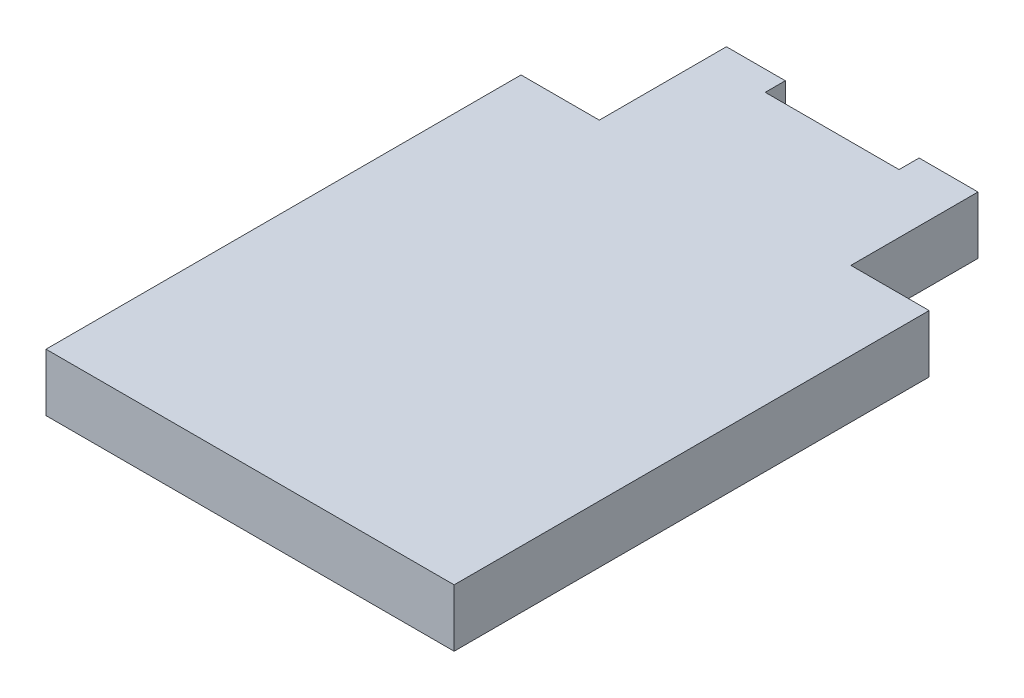
ISO-10303-21;
HEADER;
FILE_DESCRIPTION(('STEP AP214'),'2;1');
FILE_NAME('part.step','',(''),(''),'','','');
FILE_SCHEMA(('AUTOMOTIVE_DESIGN { 1 0 10303 214 1 1 1 1 }'));
ENDSEC;
DATA;
#1=APPLICATION_CONTEXT('core data for automotive mechanical design processes');
#2=APPLICATION_PROTOCOL_DEFINITION('international standard','automotive_design',2000,#1);
#3=PRODUCT_CONTEXT('',#1,'mechanical');
#4=PRODUCT('Part','Part','',(#3));
#5=PRODUCT_RELATED_PRODUCT_CATEGORY('part','',(#4));
#6=PRODUCT_DEFINITION_FORMATION('','',#4);
#7=PRODUCT_DEFINITION_CONTEXT('part definition',#1,'design');
#8=PRODUCT_DEFINITION('design','',#6,#7);
#9=PRODUCT_DEFINITION_SHAPE('','',#8);
#10=(LENGTH_UNIT() NAMED_UNIT(*) SI_UNIT(.MILLI.,.METRE.));
#11=(NAMED_UNIT(*) PLANE_ANGLE_UNIT() SI_UNIT($,.RADIAN.));
#12=(NAMED_UNIT(*) SI_UNIT($,.STERADIAN.) SOLID_ANGLE_UNIT());
#13=UNCERTAINTY_MEASURE_WITH_UNIT(LENGTH_MEASURE(1.E-05),#10,'distance_accuracy_value','');
#14=(GEOMETRIC_REPRESENTATION_CONTEXT(3) GLOBAL_UNCERTAINTY_ASSIGNED_CONTEXT((#13)) GLOBAL_UNIT_ASSIGNED_CONTEXT((#10,
#11,#12)) REPRESENTATION_CONTEXT('',''));
#15=CARTESIAN_POINT('',(0.,0.,0.));
#16=DIRECTION('',(0.,0.,1.));
#17=DIRECTION('',(1.,0.,0.));
#18=AXIS2_PLACEMENT_3D('',#15,#16,#17);
#19=CARTESIAN_POINT('',(-10.0680991990088,-7.54642357765199,-3.3));
#20=DIRECTION('',(0.,1.,0.));
#21=DIRECTION('',(0.,0.,1.));
#22=AXIS2_PLACEMENT_3D('',#19,#20,#21);
#23=PLANE('',#22);
#24=DIRECTION('',(-1.,0.,0.));
#25=VECTOR('',#24,1.);
#26=CARTESIAN_POINT('',(-10.0680991990088,-7.54642357765199,-3.3));
#27=LINE('',#26,#25);
#28=CARTESIAN_POINT('',(-8.62809919900875,-7.54642357765199,-3.3));
#29=VERTEX_POINT('',#28);
#30=CARTESIAN_POINT('',(-9.06809919900875,-7.54642357765199,-3.3));
#31=VERTEX_POINT('',#30);
#32=EDGE_CURVE('E11',#29,#31,#27,.T.);
#33=ORIENTED_EDGE('',*,*,#32,.T.);
#34=DIRECTION('',(0.,0.,1.));
#35=VECTOR('',#34,1.);
#36=CARTESIAN_POINT('',(-9.06809919900875,-7.54642357765199,-3.3));
#37=LINE('',#36,#35);
#38=CARTESIAN_POINT('',(-9.06809919900875,-7.54642357765199,-3.15));
#39=VERTEX_POINT('',#38);
#40=EDGE_CURVE('E24',#31,#39,#37,.T.);
#41=ORIENTED_EDGE('',*,*,#40,.T.);
#42=DIRECTION('',(-1.,0.,0.));
#43=VECTOR('',#42,1.);
#44=CARTESIAN_POINT('',(-10.0680991990088,-7.54642357765199,-3.15));
#45=LINE('',#44,#43);
#46=CARTESIAN_POINT('',(-10.0680991990088,-7.54642357765199,-3.15));
#47=VERTEX_POINT('',#46);
#48=EDGE_CURVE('E200',#39,#47,#45,.T.);
#49=ORIENTED_EDGE('',*,*,#48,.T.);
#50=DIRECTION('',(0.,0.,-1.));
#51=VECTOR('',#50,1.);
#52=CARTESIAN_POINT('',(-10.0680991990088,-7.54642357765199,-3.3));
#53=LINE('',#52,#51);
#54=CARTESIAN_POINT('',(-10.0680991990088,-7.54642357765199,-3.3));
#55=VERTEX_POINT('',#54);
#56=EDGE_CURVE('E118',#47,#55,#53,.T.);
#57=ORIENTED_EDGE('',*,*,#56,.T.);
#58=DIRECTION('',(-1.,0.,0.));
#59=VECTOR('',#58,1.);
#60=CARTESIAN_POINT('',(-10.0680991990088,-7.54642357765199,-3.3));
#61=LINE('',#60,#59);
#62=CARTESIAN_POINT('',(-10.5080991990088,-7.54642357765199,-3.3));
#63=VERTEX_POINT('',#62);
#64=EDGE_CURVE('E197',#55,#63,#61,.T.);
#65=ORIENTED_EDGE('',*,*,#64,.T.);
#66=DIRECTION('',(0.,0.,1.));
#67=VECTOR('',#66,1.);
#68=CARTESIAN_POINT('',(-10.5080991990088,-7.54642357765199,-3.3));
#69=LINE('',#68,#67);
#70=CARTESIAN_POINT('',(-10.5080991990088,-7.54642357765199,-2.35));
#71=VERTEX_POINT('',#70);
#72=EDGE_CURVE('E195',#63,#71,#69,.T.);
#73=ORIENTED_EDGE('',*,*,#72,.T.);
#74=DIRECTION('',(-1.,0.,0.));
#75=VECTOR('',#74,1.);
#76=CARTESIAN_POINT('',(-10.0680991990088,-7.54642357765199,-2.35));
#77=LINE('',#76,#75);
#78=CARTESIAN_POINT('',(-11.0930991990088,-7.54642357765199,-2.35));
#79=VERTEX_POINT('',#78);
#80=EDGE_CURVE('E193',#71,#79,#77,.T.);
#81=ORIENTED_EDGE('',*,*,#80,.T.);
#82=DIRECTION('',(0.,0.,1.));
#83=VECTOR('',#82,1.);
#84=CARTESIAN_POINT('',(-11.0930991990088,-7.54642357765199,-3.3));
#85=LINE('',#84,#83);
#86=CARTESIAN_POINT('',(-11.0930991990088,-7.54642357765198,1.2));
#87=VERTEX_POINT('',#86);
#88=EDGE_CURVE('E191',#79,#87,#85,.T.);
#89=ORIENTED_EDGE('',*,*,#88,.T.);
#90=DIRECTION('',(1.,0.,0.));
#91=VECTOR('',#90,1.);
#92=CARTESIAN_POINT('',(-10.0680991990088,-7.54642357765199,1.2));
#93=LINE('',#92,#91);
#94=CARTESIAN_POINT('',(-8.04309919900875,-7.54642357765199,1.2));
#95=VERTEX_POINT('',#94);
#96=EDGE_CURVE('E189',#87,#95,#93,.T.);
#97=ORIENTED_EDGE('',*,*,#96,.T.);
#98=DIRECTION('',(0.,0.,-1.));
#99=VECTOR('',#98,1.);
#100=CARTESIAN_POINT('',(-8.04309919900875,-7.54642357765199,-3.3));
#101=LINE('',#100,#99);
#102=CARTESIAN_POINT('',(-8.04309919900875,-7.54642357765199,-2.35));
#103=VERTEX_POINT('',#102);
#104=EDGE_CURVE('E187',#95,#103,#101,.T.);
#105=ORIENTED_EDGE('',*,*,#104,.T.);
#106=DIRECTION('',(-1.,0.,0.));
#107=VECTOR('',#106,1.);
#108=CARTESIAN_POINT('',(-10.0680991990088,-7.54642357765199,-2.35));
#109=LINE('',#108,#107);
#110=CARTESIAN_POINT('',(-8.62809919900875,-7.54642357765199,-2.35));
#111=VERTEX_POINT('',#110);
#112=EDGE_CURVE('E185',#103,#111,#109,.T.);
#113=ORIENTED_EDGE('',*,*,#112,.T.);
#114=DIRECTION('',(0.,0.,-1.));
#115=VECTOR('',#114,1.);
#116=CARTESIAN_POINT('',(-8.62809919900875,-7.54642357765199,-3.3));
#117=LINE('',#116,#115);
#118=EDGE_CURVE('E183',#111,#29,#117,.T.);
#119=ORIENTED_EDGE('',*,*,#118,.T.);
#120=EDGE_LOOP('',(#33,#41,#49,#57,#65,#73,#81,#89,#97,#105,#113,#119));
#121=FACE_BOUND('',#120,.T.);
#122=ADVANCED_FACE('F17',(#121),#23,.T.);
#123=CARTESIAN_POINT('',(-9.06809919900875,-7.97642357765199,-3.225));
#124=DIRECTION('',(-1.,0.,0.));
#125=DIRECTION('',(0.,0.,1.));
#126=AXIS2_PLACEMENT_3D('',#123,#124,#125);
#127=PLANE('',#126);
#128=DIRECTION('',(0.,0.,1.));
#129=VECTOR('',#128,1.);
#130=CARTESIAN_POINT('',(-9.06809919900875,-7.97642357765199,-2.825));
#131=LINE('',#130,#129);
#132=CARTESIAN_POINT('',(-9.06809919900875,-7.97642357765199,-3.3));
#133=VERTEX_POINT('',#132);
#134=CARTESIAN_POINT('',(-9.06809919900875,-7.97642357765199,-3.15));
#135=VERTEX_POINT('',#134);
#136=EDGE_CURVE('E181',#133,#135,#131,.T.);
#137=ORIENTED_EDGE('',*,*,#136,.T.);
#138=DIRECTION('',(0.,1.,0.));
#139=VECTOR('',#138,1.);
#140=CARTESIAN_POINT('',(-9.06809919900875,-7.97642357765199,-3.15));
#141=LINE('',#140,#139);
#142=EDGE_CURVE('E125',#135,#39,#141,.T.);
#143=ORIENTED_EDGE('',*,*,#142,.T.);
#144=ORIENTED_EDGE('',*,*,#40,.F.);
#145=DIRECTION('',(0.,-1.,0.));
#146=VECTOR('',#145,1.);
#147=CARTESIAN_POINT('',(-9.06809919900875,-7.97642357765199,-3.3));
#148=LINE('',#147,#146);
#149=EDGE_CURVE('E177',#31,#133,#148,.T.);
#150=ORIENTED_EDGE('',*,*,#149,.T.);
#151=EDGE_LOOP('',(#137,#143,#144,#150));
#152=FACE_BOUND('',#151,.T.);
#153=ADVANCED_FACE('F202',(#152),#127,.T.);
#154=CARTESIAN_POINT('',(-8.84809919900875,-7.97642357765199,-3.3));
#155=DIRECTION('',(0.,0.,-1.));
#156=DIRECTION('',(0.,1.,0.));
#157=AXIS2_PLACEMENT_3D('',#154,#155,#156);
#158=PLANE('',#157);
#159=DIRECTION('',(-1.,0.,0.));
#160=VECTOR('',#159,1.);
#161=CARTESIAN_POINT('',(-9.56809919900875,-7.97642357765199,-3.3));
#162=LINE('',#161,#160);
#163=CARTESIAN_POINT('',(-8.62809919900875,-7.97642357765199,-3.3));
#164=VERTEX_POINT('',#163);
#165=EDGE_CURVE('E174',#164,#133,#162,.T.);
#166=ORIENTED_EDGE('',*,*,#165,.T.);
#167=ORIENTED_EDGE('',*,*,#149,.F.);
#168=ORIENTED_EDGE('',*,*,#32,.F.);
#169=DIRECTION('',(0.,-1.,0.));
#170=VECTOR('',#169,1.);
#171=CARTESIAN_POINT('',(-8.62809919900875,-7.97642357765199,-3.3));
#172=LINE('',#171,#170);
#173=EDGE_CURVE('E172',#29,#164,#172,.T.);
#174=ORIENTED_EDGE('',*,*,#173,.T.);
#175=EDGE_LOOP('',(#166,#167,#168,#174));
#176=FACE_BOUND('',#175,.T.);
#177=ADVANCED_FACE('F204',(#176),#158,.T.);
#178=CARTESIAN_POINT('',(-8.62809919900875,-7.97642357765199,-2.825));
#179=DIRECTION('',(1.,0.,0.));
#180=DIRECTION('',(0.,0.,-1.));
#181=AXIS2_PLACEMENT_3D('',#178,#179,#180);
#182=PLANE('',#181);
#183=DIRECTION('',(0.,0.,-1.));
#184=VECTOR('',#183,1.);
#185=CARTESIAN_POINT('',(-8.62809919900875,-7.97642357765199,-2.825));
#186=LINE('',#185,#184);
#187=CARTESIAN_POINT('',(-8.62809919900875,-7.97642357765199,-2.35));
#188=VERTEX_POINT('',#187);
#189=EDGE_CURVE('E169',#188,#164,#186,.T.);
#190=ORIENTED_EDGE('',*,*,#189,.T.);
#191=ORIENTED_EDGE('',*,*,#173,.F.);
#192=ORIENTED_EDGE('',*,*,#118,.F.);
#193=DIRECTION('',(0.,-1.,0.));
#194=VECTOR('',#193,1.);
#195=CARTESIAN_POINT('',(-8.62809919900875,-7.97642357765199,-2.35));
#196=LINE('',#195,#194);
#197=EDGE_CURVE('E166',#111,#188,#196,.T.);
#198=ORIENTED_EDGE('',*,*,#197,.T.);
#199=EDGE_LOOP('',(#190,#191,#192,#198));
#200=FACE_BOUND('',#199,.T.);
#201=ADVANCED_FACE('F207',(#200),#182,.T.);
#202=CARTESIAN_POINT('',(-8.33559919900875,-7.97642357765199,-2.35));
#203=DIRECTION('',(0.,0.,-1.));
#204=DIRECTION('',(0.,1.,0.));
#205=AXIS2_PLACEMENT_3D('',#202,#203,#204);
#206=PLANE('',#205);
#207=DIRECTION('',(-1.,0.,0.));
#208=VECTOR('',#207,1.);
#209=CARTESIAN_POINT('',(-9.56809919900875,-7.97642357765199,-2.35));
#210=LINE('',#209,#208);
#211=CARTESIAN_POINT('',(-8.04309919900875,-7.97642357765199,-2.35));
#212=VERTEX_POINT('',#211);
#213=EDGE_CURVE('E163',#212,#188,#210,.T.);
#214=ORIENTED_EDGE('',*,*,#213,.T.);
#215=ORIENTED_EDGE('',*,*,#197,.F.);
#216=ORIENTED_EDGE('',*,*,#112,.F.);
#217=DIRECTION('',(0.,-1.,0.));
#218=VECTOR('',#217,1.);
#219=CARTESIAN_POINT('',(-8.04309919900875,-7.97642357765199,-2.35));
#220=LINE('',#219,#218);
#221=EDGE_CURVE('E160',#103,#212,#220,.T.);
#222=ORIENTED_EDGE('',*,*,#221,.T.);
#223=EDGE_LOOP('',(#214,#215,#216,#222));
#224=FACE_BOUND('',#223,.T.);
#225=ADVANCED_FACE('F211',(#224),#206,.T.);
#226=CARTESIAN_POINT('',(-8.04309919900875,-7.97642357765199,-0.575000000000003));
#227=DIRECTION('',(1.,0.,0.));
#228=DIRECTION('',(0.,0.,-1.));
#229=AXIS2_PLACEMENT_3D('',#226,#227,#228);
#230=PLANE('',#229);
#231=DIRECTION('',(0.,0.,-1.));
#232=VECTOR('',#231,1.);
#233=CARTESIAN_POINT('',(-8.04309919900875,-7.97642357765198,-0.575000000000003));
#234=LINE('',#233,#232);
#235=CARTESIAN_POINT('',(-8.04309919900875,-7.97642357765198,1.2));
#236=VERTEX_POINT('',#235);
#237=EDGE_CURVE('E157',#236,#212,#234,.T.);
#238=ORIENTED_EDGE('',*,*,#237,.T.);
#239=ORIENTED_EDGE('',*,*,#221,.F.);
#240=ORIENTED_EDGE('',*,*,#104,.F.);
#241=DIRECTION('',(0.,-1.,0.));
#242=VECTOR('',#241,1.);
#243=CARTESIAN_POINT('',(-8.04309919900875,-7.97642357765199,1.2));
#244=LINE('',#243,#242);
#245=EDGE_CURVE('E154',#95,#236,#244,.T.);
#246=ORIENTED_EDGE('',*,*,#245,.T.);
#247=EDGE_LOOP('',(#238,#239,#240,#246));
#248=FACE_BOUND('',#247,.T.);
#249=ADVANCED_FACE('F216',(#248),#230,.T.);
#250=CARTESIAN_POINT('',(-9.56809919900875,-7.97642357765198,1.2));
#251=DIRECTION('',(0.,0.,1.));
#252=DIRECTION('',(0.,-1.,0.));
#253=AXIS2_PLACEMENT_3D('',#250,#251,#252);
#254=PLANE('',#253);
#255=DIRECTION('',(1.,0.,0.));
#256=VECTOR('',#255,1.);
#257=CARTESIAN_POINT('',(-9.56809919900875,-7.97642357765198,1.2));
#258=LINE('',#257,#256);
#259=CARTESIAN_POINT('',(-11.0930991990088,-7.97642357765199,1.2));
#260=VERTEX_POINT('',#259);
#261=EDGE_CURVE('E151',#260,#236,#258,.T.);
#262=ORIENTED_EDGE('',*,*,#261,.T.);
#263=ORIENTED_EDGE('',*,*,#245,.F.);
#264=ORIENTED_EDGE('',*,*,#96,.F.);
#265=DIRECTION('',(0.,-1.,0.));
#266=VECTOR('',#265,1.);
#267=CARTESIAN_POINT('',(-11.0930991990088,-7.97642357765198,1.2));
#268=LINE('',#267,#266);
#269=EDGE_CURVE('E148',#87,#260,#268,.T.);
#270=ORIENTED_EDGE('',*,*,#269,.T.);
#271=EDGE_LOOP('',(#262,#263,#264,#270));
#272=FACE_BOUND('',#271,.T.);
#273=ADVANCED_FACE('F219',(#272),#254,.T.);
#274=CARTESIAN_POINT('',(-11.0930991990088,-7.97642357765199,-0.575000000000003));
#275=DIRECTION('',(-1.,0.,0.));
#276=DIRECTION('',(0.,0.,1.));
#277=AXIS2_PLACEMENT_3D('',#274,#275,#276);
#278=PLANE('',#277);
#279=DIRECTION('',(0.,0.,1.));
#280=VECTOR('',#279,1.);
#281=CARTESIAN_POINT('',(-11.0930991990088,-7.97642357765199,-0.575000000000003));
#282=LINE('',#281,#280);
#283=CARTESIAN_POINT('',(-11.0930991990088,-7.97642357765199,-2.35));
#284=VERTEX_POINT('',#283);
#285=EDGE_CURVE('E145',#284,#260,#282,.T.);
#286=ORIENTED_EDGE('',*,*,#285,.T.);
#287=ORIENTED_EDGE('',*,*,#269,.F.);
#288=ORIENTED_EDGE('',*,*,#88,.F.);
#289=DIRECTION('',(0.,-1.,0.));
#290=VECTOR('',#289,1.);
#291=CARTESIAN_POINT('',(-11.0930991990088,-7.97642357765199,-2.35));
#292=LINE('',#291,#290);
#293=EDGE_CURVE('E142',#79,#284,#292,.T.);
#294=ORIENTED_EDGE('',*,*,#293,.T.);
#295=EDGE_LOOP('',(#286,#287,#288,#294));
#296=FACE_BOUND('',#295,.T.);
#297=ADVANCED_FACE('F223',(#296),#278,.T.);
#298=CARTESIAN_POINT('',(-10.8005991990088,-7.97642357765199,-2.35));
#299=DIRECTION('',(0.,0.,-1.));
#300=DIRECTION('',(0.,1.,0.));
#301=AXIS2_PLACEMENT_3D('',#298,#299,#300);
#302=PLANE('',#301);
#303=DIRECTION('',(-1.,0.,0.));
#304=VECTOR('',#303,1.);
#305=CARTESIAN_POINT('',(-10.8005991990088,-7.97642357765199,-2.35));
#306=LINE('',#305,#304);
#307=CARTESIAN_POINT('',(-10.5080991990088,-7.97642357765199,-2.35));
#308=VERTEX_POINT('',#307);
#309=EDGE_CURVE('E139',#308,#284,#306,.T.);
#310=ORIENTED_EDGE('',*,*,#309,.T.);
#311=ORIENTED_EDGE('',*,*,#293,.F.);
#312=ORIENTED_EDGE('',*,*,#80,.F.);
#313=DIRECTION('',(0.,-1.,0.));
#314=VECTOR('',#313,1.);
#315=CARTESIAN_POINT('',(-10.5080991990088,-7.97642357765199,-2.35));
#316=LINE('',#315,#314);
#317=EDGE_CURVE('E136',#71,#308,#316,.T.);
#318=ORIENTED_EDGE('',*,*,#317,.T.);
#319=EDGE_LOOP('',(#310,#311,#312,#318));
#320=FACE_BOUND('',#319,.T.);
#321=ADVANCED_FACE('F228',(#320),#302,.T.);
#322=CARTESIAN_POINT('',(-10.5080991990088,-7.97642357765199,-2.825));
#323=DIRECTION('',(-1.,0.,0.));
#324=DIRECTION('',(0.,0.,1.));
#325=AXIS2_PLACEMENT_3D('',#322,#323,#324);
#326=PLANE('',#325);
#327=DIRECTION('',(0.,0.,1.));
#328=VECTOR('',#327,1.);
#329=CARTESIAN_POINT('',(-10.5080991990088,-7.97642357765199,-2.825));
#330=LINE('',#329,#328);
#331=CARTESIAN_POINT('',(-10.5080991990088,-7.97642357765199,-3.3));
#332=VERTEX_POINT('',#331);
#333=EDGE_CURVE('E133',#332,#308,#330,.T.);
#334=ORIENTED_EDGE('',*,*,#333,.T.);
#335=ORIENTED_EDGE('',*,*,#317,.F.);
#336=ORIENTED_EDGE('',*,*,#72,.F.);
#337=DIRECTION('',(0.,-1.,0.));
#338=VECTOR('',#337,1.);
#339=CARTESIAN_POINT('',(-10.5080991990088,-7.97642357765199,-3.3));
#340=LINE('',#339,#338);
#341=EDGE_CURVE('E130',#63,#332,#340,.T.);
#342=ORIENTED_EDGE('',*,*,#341,.T.);
#343=EDGE_LOOP('',(#334,#335,#336,#342));
#344=FACE_BOUND('',#343,.T.);
#345=ADVANCED_FACE('F231',(#344),#326,.T.);
#346=CARTESIAN_POINT('',(-10.2880991990088,-7.97642357765199,-3.3));
#347=DIRECTION('',(0.,0.,-1.));
#348=DIRECTION('',(0.,1.,0.));
#349=AXIS2_PLACEMENT_3D('',#346,#347,#348);
#350=PLANE('',#349);
#351=DIRECTION('',(-1.,0.,0.));
#352=VECTOR('',#351,1.);
#353=CARTESIAN_POINT('',(-10.2880991990088,-7.97642357765199,-3.3));
#354=LINE('',#353,#352);
#355=CARTESIAN_POINT('',(-10.0680991990088,-7.97642357765199,-3.3));
#356=VERTEX_POINT('',#355);
#357=EDGE_CURVE('E108',#356,#332,#354,.T.);
#358=ORIENTED_EDGE('',*,*,#357,.T.);
#359=ORIENTED_EDGE('',*,*,#341,.F.);
#360=ORIENTED_EDGE('',*,*,#64,.F.);
#361=DIRECTION('',(0.,-1.,0.));
#362=VECTOR('',#361,1.);
#363=CARTESIAN_POINT('',(-10.0680991990088,-7.97642357765199,-3.3));
#364=LINE('',#363,#362);
#365=EDGE_CURVE('E112',#55,#356,#364,.T.);
#366=ORIENTED_EDGE('',*,*,#365,.T.);
#367=EDGE_LOOP('',(#358,#359,#360,#366));
#368=FACE_BOUND('',#367,.T.);
#369=ADVANCED_FACE('F235',(#368),#350,.T.);
#370=CARTESIAN_POINT('',(-10.0680991990088,-7.97642357765199,-3.225));
#371=DIRECTION('',(1.,0.,0.));
#372=DIRECTION('',(0.,0.,-1.));
#373=AXIS2_PLACEMENT_3D('',#370,#371,#372);
#374=PLANE('',#373);
#375=DIRECTION('',(0.,0.,-1.));
#376=VECTOR('',#375,1.);
#377=CARTESIAN_POINT('',(-10.0680991990088,-7.97642357765199,-3.225));
#378=LINE('',#377,#376);
#379=CARTESIAN_POINT('',(-10.0680991990088,-7.97642357765199,-3.15));
#380=VERTEX_POINT('',#379);
#381=EDGE_CURVE('E102',#380,#356,#378,.T.);
#382=ORIENTED_EDGE('',*,*,#381,.T.);
#383=ORIENTED_EDGE('',*,*,#365,.F.);
#384=ORIENTED_EDGE('',*,*,#56,.F.);
#385=DIRECTION('',(0.,-1.,0.));
#386=VECTOR('',#385,1.);
#387=CARTESIAN_POINT('',(-10.0680991990088,-7.97642357765199,-3.15));
#388=LINE('',#387,#386);
#389=EDGE_CURVE('E113',#47,#380,#388,.T.);
#390=ORIENTED_EDGE('',*,*,#389,.T.);
#391=EDGE_LOOP('',(#382,#383,#384,#390));
#392=FACE_BOUND('',#391,.T.);
#393=ADVANCED_FACE('F117',(#392),#374,.T.);
#394=CARTESIAN_POINT('',(-9.56809919900875,-7.97642357765199,-3.15));
#395=DIRECTION('',(0.,0.,-1.));
#396=DIRECTION('',(0.,1.,0.));
#397=AXIS2_PLACEMENT_3D('',#394,#395,#396);
#398=PLANE('',#397);
#399=DIRECTION('',(-1.,0.,0.));
#400=VECTOR('',#399,1.);
#401=CARTESIAN_POINT('',(-9.56809919900875,-7.97642357765199,-3.15));
#402=LINE('',#401,#400);
#403=EDGE_CURVE('E106',#135,#380,#402,.T.);
#404=ORIENTED_EDGE('',*,*,#403,.T.);
#405=ORIENTED_EDGE('',*,*,#389,.F.);
#406=ORIENTED_EDGE('',*,*,#48,.F.);
#407=ORIENTED_EDGE('',*,*,#142,.F.);
#408=EDGE_LOOP('',(#404,#405,#406,#407));
#409=FACE_BOUND('',#408,.T.);
#410=ADVANCED_FACE('F123',(#409),#398,.T.);
#411=CARTESIAN_POINT('',(-9.56809919900875,-7.97642357765199,-2.825));
#412=DIRECTION('',(0.,1.,0.));
#413=DIRECTION('',(0.,0.,1.));
#414=AXIS2_PLACEMENT_3D('',#411,#412,#413);
#415=PLANE('',#414);
#416=ORIENTED_EDGE('',*,*,#403,.F.);
#417=ORIENTED_EDGE('',*,*,#136,.F.);
#418=ORIENTED_EDGE('',*,*,#165,.F.);
#419=ORIENTED_EDGE('',*,*,#189,.F.);
#420=ORIENTED_EDGE('',*,*,#213,.F.);
#421=ORIENTED_EDGE('',*,*,#237,.F.);
#422=ORIENTED_EDGE('',*,*,#261,.F.);
#423=ORIENTED_EDGE('',*,*,#285,.F.);
#424=ORIENTED_EDGE('',*,*,#309,.F.);
#425=ORIENTED_EDGE('',*,*,#333,.F.);
#426=ORIENTED_EDGE('',*,*,#357,.F.);
#427=ORIENTED_EDGE('',*,*,#381,.F.);
#428=EDGE_LOOP('',(#416,#417,#418,#419,#420,#421,#422,#423,#424,#425,#426,#427));
#429=FACE_BOUND('',#428,.T.);
#430=ADVANCED_FACE('F104',(#429),#415,.F.);
#431=CLOSED_SHELL('',(#122,#153,#177,#201,#225,#249,#273,#297,#321,#345,#369,#393,#410,#430));
#432=MANIFOLD_SOLID_BREP('B1',#431);
#433=ADVANCED_BREP_SHAPE_REPRESENTATION('',(#18,#432),#14);
#434=SHAPE_DEFINITION_REPRESENTATION(#9,#433);
ENDSEC;
END-ISO-10303-21;
